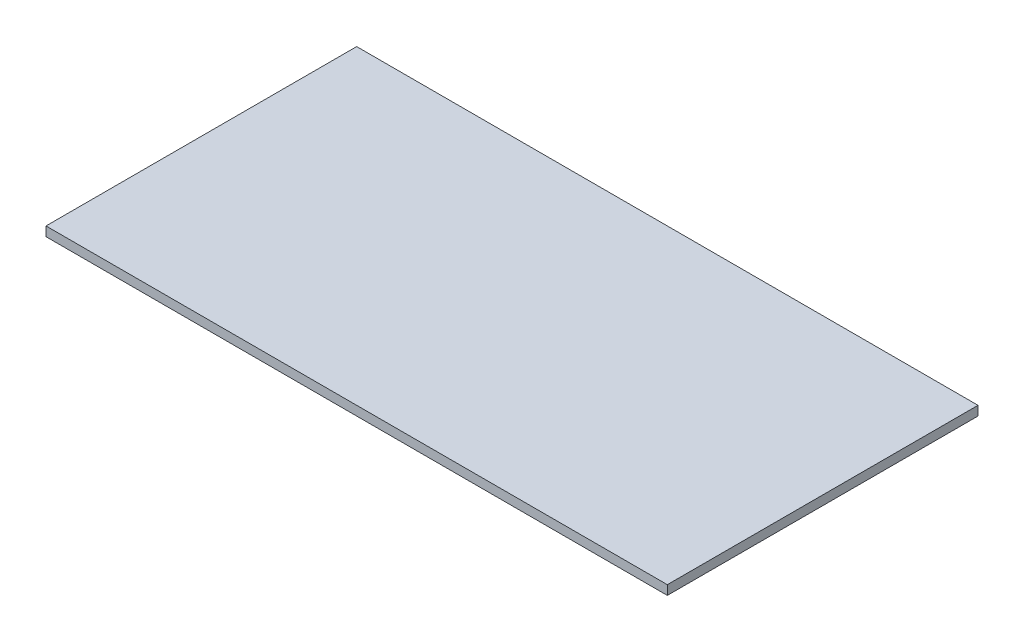
ISO-10303-21;
HEADER;
FILE_DESCRIPTION(('STEP AP214'),'2;1');
FILE_NAME('part.step','',(''),(''),'','','');
FILE_SCHEMA(('AUTOMOTIVE_DESIGN { 1 0 10303 214 1 1 1 1 }'));
ENDSEC;
DATA;
#1=APPLICATION_CONTEXT('core data for automotive mechanical design processes');
#2=APPLICATION_PROTOCOL_DEFINITION('international standard','automotive_design',2000,#1);
#3=PRODUCT_CONTEXT('',#1,'mechanical');
#4=PRODUCT('Part','Part','',(#3));
#5=PRODUCT_RELATED_PRODUCT_CATEGORY('part','',(#4));
#6=PRODUCT_DEFINITION_FORMATION('','',#4);
#7=PRODUCT_DEFINITION_CONTEXT('part definition',#1,'design');
#8=PRODUCT_DEFINITION('design','',#6,#7);
#9=PRODUCT_DEFINITION_SHAPE('','',#8);
#10=(LENGTH_UNIT() NAMED_UNIT(*) SI_UNIT(.MILLI.,.METRE.));
#11=(NAMED_UNIT(*) PLANE_ANGLE_UNIT() SI_UNIT($,.RADIAN.));
#12=(NAMED_UNIT(*) SI_UNIT($,.STERADIAN.) SOLID_ANGLE_UNIT());
#13=UNCERTAINTY_MEASURE_WITH_UNIT(LENGTH_MEASURE(1.E-05),#10,'distance_accuracy_value','');
#14=(GEOMETRIC_REPRESENTATION_CONTEXT(3) GLOBAL_UNCERTAINTY_ASSIGNED_CONTEXT((#13)) GLOBAL_UNIT_ASSIGNED_CONTEXT((#10,
#11,#12)) REPRESENTATION_CONTEXT('',''));
#15=CARTESIAN_POINT('',(0.,0.,0.));
#16=DIRECTION('',(0.,0.,1.));
#17=DIRECTION('',(1.,0.,0.));
#18=AXIS2_PLACEMENT_3D('',#15,#16,#17);
#19=CARTESIAN_POINT('',(-500.,15.,-250.));
#20=DIRECTION('',(1.,0.,0.));
#21=DIRECTION('',(0.,0.,-1.));
#22=AXIS2_PLACEMENT_3D('',#19,#20,#21);
#23=PLANE('',#22);
#24=DIRECTION('',(0.,0.,1.));
#25=VECTOR('',#24,1.);
#26=CARTESIAN_POINT('',(-500.,0.,-250.));
#27=LINE('',#26,#25);
#28=CARTESIAN_POINT('',(-500.,0.,-250.));
#29=VERTEX_POINT('',#28);
#30=CARTESIAN_POINT('',(-500.,0.,250.));
#31=VERTEX_POINT('',#30);
#32=EDGE_CURVE('E96',#29,#31,#27,.T.);
#33=ORIENTED_EDGE('',*,*,#32,.T.);
#34=DIRECTION('',(0.,-1.,0.));
#35=VECTOR('',#34,1.);
#36=CARTESIAN_POINT('',(-500.,15.,250.));
#37=LINE('',#36,#35);
#38=CARTESIAN_POINT('',(-500.,15.,250.));
#39=VERTEX_POINT('',#38);
#40=EDGE_CURVE('E11',#39,#31,#37,.T.);
#41=ORIENTED_EDGE('',*,*,#40,.F.);
#42=DIRECTION('',(0.,0.,1.));
#43=VECTOR('',#42,1.);
#44=CARTESIAN_POINT('',(-500.,15.,-250.));
#45=LINE('',#44,#43);
#46=CARTESIAN_POINT('',(-500.,15.,-250.));
#47=VERTEX_POINT('',#46);
#48=EDGE_CURVE('E84',#47,#39,#45,.T.);
#49=ORIENTED_EDGE('',*,*,#48,.F.);
#50=DIRECTION('',(0.,-1.,0.));
#51=VECTOR('',#50,1.);
#52=CARTESIAN_POINT('',(-500.,15.,-250.));
#53=LINE('',#52,#51);
#54=EDGE_CURVE('E92',#47,#29,#53,.T.);
#55=ORIENTED_EDGE('',*,*,#54,.T.);
#56=EDGE_LOOP('',(#33,#41,#49,#55));
#57=FACE_BOUND('',#56,.T.);
#58=ADVANCED_FACE('F33',(#57),#23,.F.);
#59=CARTESIAN_POINT('',(-500.,15.,250.));
#60=DIRECTION('',(0.,0.,-1.));
#61=DIRECTION('',(-1.,0.,0.));
#62=AXIS2_PLACEMENT_3D('',#59,#60,#61);
#63=PLANE('',#62);
#64=DIRECTION('',(1.,0.,0.));
#65=VECTOR('',#64,1.);
#66=CARTESIAN_POINT('',(-500.,0.,250.));
#67=LINE('',#66,#65);
#68=CARTESIAN_POINT('',(500.,0.,250.));
#69=VERTEX_POINT('',#68);
#70=EDGE_CURVE('E88',#31,#69,#67,.T.);
#71=ORIENTED_EDGE('',*,*,#70,.T.);
#72=DIRECTION('',(0.,-1.,0.));
#73=VECTOR('',#72,1.);
#74=CARTESIAN_POINT('',(500.,15.,250.));
#75=LINE('',#74,#73);
#76=CARTESIAN_POINT('',(500.,15.,250.));
#77=VERTEX_POINT('',#76);
#78=EDGE_CURVE('E41',#77,#69,#75,.T.);
#79=ORIENTED_EDGE('',*,*,#78,.F.);
#80=DIRECTION('',(1.,0.,0.));
#81=VECTOR('',#80,1.);
#82=CARTESIAN_POINT('',(-500.,15.,250.));
#83=LINE('',#82,#81);
#84=EDGE_CURVE('E79',#39,#77,#83,.T.);
#85=ORIENTED_EDGE('',*,*,#84,.F.);
#86=ORIENTED_EDGE('',*,*,#40,.T.);
#87=EDGE_LOOP('',(#71,#79,#85,#86));
#88=FACE_BOUND('',#87,.T.);
#89=ADVANCED_FACE('F87',(#88),#63,.F.);
#90=CARTESIAN_POINT('',(500.,15.,-250.));
#91=DIRECTION('',(-1.,0.,0.));
#92=DIRECTION('',(0.,0.,1.));
#93=AXIS2_PLACEMENT_3D('',#90,#91,#92);
#94=PLANE('',#93);
#95=DIRECTION('',(0.,0.,-1.));
#96=VECTOR('',#95,1.);
#97=CARTESIAN_POINT('',(500.,0.,-250.));
#98=LINE('',#97,#96);
#99=CARTESIAN_POINT('',(500.,0.,-250.));
#100=VERTEX_POINT('',#99);
#101=EDGE_CURVE('E66',#69,#100,#98,.T.);
#102=ORIENTED_EDGE('',*,*,#101,.T.);
#103=DIRECTION('',(0.,-1.,0.));
#104=VECTOR('',#103,1.);
#105=CARTESIAN_POINT('',(500.,15.,-250.));
#106=LINE('',#105,#104);
#107=CARTESIAN_POINT('',(500.,15.,-250.));
#108=VERTEX_POINT('',#107);
#109=EDGE_CURVE('E89',#108,#100,#106,.T.);
#110=ORIENTED_EDGE('',*,*,#109,.F.);
#111=DIRECTION('',(0.,0.,-1.));
#112=VECTOR('',#111,1.);
#113=CARTESIAN_POINT('',(500.,15.,-250.));
#114=LINE('',#113,#112);
#115=EDGE_CURVE('E82',#77,#108,#114,.T.);
#116=ORIENTED_EDGE('',*,*,#115,.F.);
#117=ORIENTED_EDGE('',*,*,#78,.T.);
#118=EDGE_LOOP('',(#102,#110,#116,#117));
#119=FACE_BOUND('',#118,.T.);
#120=ADVANCED_FACE('F90',(#119),#94,.F.);
#121=CARTESIAN_POINT('',(-500.,15.,-250.));
#122=DIRECTION('',(0.,0.,1.));
#123=DIRECTION('',(1.,0.,0.));
#124=AXIS2_PLACEMENT_3D('',#121,#122,#123);
#125=PLANE('',#124);
#126=DIRECTION('',(-1.,0.,0.));
#127=VECTOR('',#126,1.);
#128=CARTESIAN_POINT('',(-500.,0.,-250.));
#129=LINE('',#128,#127);
#130=EDGE_CURVE('E72',#100,#29,#129,.T.);
#131=ORIENTED_EDGE('',*,*,#130,.T.);
#132=ORIENTED_EDGE('',*,*,#54,.F.);
#133=DIRECTION('',(-1.,0.,0.));
#134=VECTOR('',#133,1.);
#135=CARTESIAN_POINT('',(-500.,15.,-250.));
#136=LINE('',#135,#134);
#137=EDGE_CURVE('E49',#108,#47,#136,.T.);
#138=ORIENTED_EDGE('',*,*,#137,.F.);
#139=ORIENTED_EDGE('',*,*,#109,.T.);
#140=EDGE_LOOP('',(#131,#132,#138,#139));
#141=FACE_BOUND('',#140,.T.);
#142=ADVANCED_FACE('F103',(#141),#125,.F.);
#143=CARTESIAN_POINT('',(0.,15.,0.));
#144=DIRECTION('',(0.,1.,0.));
#145=DIRECTION('',(0.,0.,1.));
#146=AXIS2_PLACEMENT_3D('',#143,#144,#145);
#147=PLANE('',#146);
#148=ORIENTED_EDGE('',*,*,#48,.T.);
#149=ORIENTED_EDGE('',*,*,#84,.T.);
#150=ORIENTED_EDGE('',*,*,#115,.T.);
#151=ORIENTED_EDGE('',*,*,#137,.T.);
#152=EDGE_LOOP('',(#148,#149,#150,#151));
#153=FACE_BOUND('',#152,.T.);
#154=ADVANCED_FACE('F80',(#153),#147,.T.);
#155=CARTESIAN_POINT('',(0.,0.,0.));
#156=DIRECTION('',(0.,1.,0.));
#157=DIRECTION('',(0.,0.,1.));
#158=AXIS2_PLACEMENT_3D('',#155,#156,#157);
#159=PLANE('',#158);
#160=ORIENTED_EDGE('',*,*,#32,.F.);
#161=ORIENTED_EDGE('',*,*,#130,.F.);
#162=ORIENTED_EDGE('',*,*,#101,.F.);
#163=ORIENTED_EDGE('',*,*,#70,.F.);
#164=EDGE_LOOP('',(#160,#161,#162,#163));
#165=FACE_BOUND('',#164,.T.);
#166=ADVANCED_FACE('F106',(#165),#159,.F.);
#167=CLOSED_SHELL('',(#58,#89,#120,#142,#154,#166));
#168=MANIFOLD_SOLID_BREP('B2',#167);
#169=ADVANCED_BREP_SHAPE_REPRESENTATION('',(#18,#168),#14);
#170=SHAPE_DEFINITION_REPRESENTATION(#9,#169);
ENDSEC;
END-ISO-10303-21;
